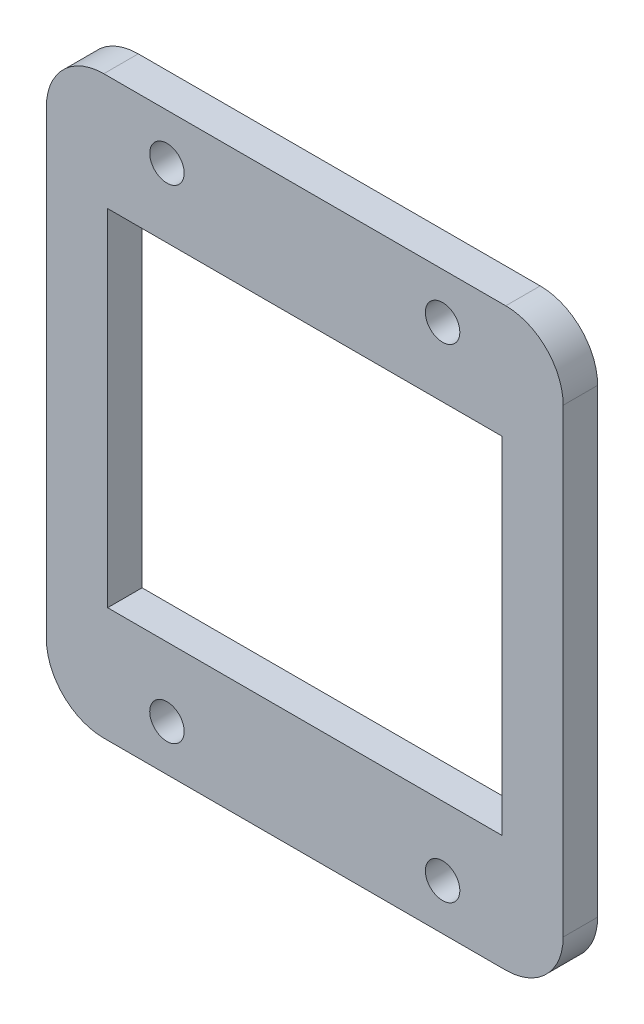
ISO-10303-21;
HEADER;
FILE_DESCRIPTION(('STEP AP214'),'2;1');
FILE_NAME('part.step','',(''),(''),'','','');
FILE_SCHEMA(('AUTOMOTIVE_DESIGN { 1 0 10303 214 1 1 1 1 }'));
ENDSEC;
DATA;
#1=APPLICATION_CONTEXT('core data for automotive mechanical design processes');
#2=APPLICATION_PROTOCOL_DEFINITION('international standard','automotive_design',2000,#1);
#3=PRODUCT_CONTEXT('',#1,'mechanical');
#4=PRODUCT('Part','Part','',(#3));
#5=PRODUCT_RELATED_PRODUCT_CATEGORY('part','',(#4));
#6=PRODUCT_DEFINITION_FORMATION('','',#4);
#7=PRODUCT_DEFINITION_CONTEXT('part definition',#1,'design');
#8=PRODUCT_DEFINITION('design','',#6,#7);
#9=PRODUCT_DEFINITION_SHAPE('','',#8);
#10=(LENGTH_UNIT() NAMED_UNIT(*) SI_UNIT(.MILLI.,.METRE.));
#11=(NAMED_UNIT(*) PLANE_ANGLE_UNIT() SI_UNIT($,.RADIAN.));
#12=(NAMED_UNIT(*) SI_UNIT($,.STERADIAN.) SOLID_ANGLE_UNIT());
#13=UNCERTAINTY_MEASURE_WITH_UNIT(LENGTH_MEASURE(1.E-05),#10,'distance_accuracy_value','');
#14=(GEOMETRIC_REPRESENTATION_CONTEXT(3) GLOBAL_UNCERTAINTY_ASSIGNED_CONTEXT((#13)) GLOBAL_UNIT_ASSIGNED_CONTEXT((#10,
#11,#12)) REPRESENTATION_CONTEXT('',''));
#15=CARTESIAN_POINT('',(0.,0.,0.));
#16=DIRECTION('',(0.,0.,1.));
#17=DIRECTION('',(1.,0.,0.));
#18=AXIS2_PLACEMENT_3D('',#15,#16,#17);
#19=CARTESIAN_POINT('',(0.,0.,3.));
#20=DIRECTION('',(0.,0.,-1.));
#21=DIRECTION('',(-1.,0.,0.));
#22=AXIS2_PLACEMENT_3D('',#19,#20,#21);
#23=PLANE('',#22);
#24=DIRECTION('',(-1.,0.,0.));
#25=VECTOR('',#24,1.);
#26=CARTESIAN_POINT('',(0.,50.1,3.));
#27=LINE('',#26,#25);
#28=CARTESIAN_POINT('',(40.,50.1,3.));
#29=VERTEX_POINT('',#28);
#30=CARTESIAN_POINT('',(5.,50.1,3.));
#31=VERTEX_POINT('',#30);
#32=EDGE_CURVE('E203',#29,#31,#27,.T.);
#33=ORIENTED_EDGE('',*,*,#32,.T.);
#34=CARTESIAN_POINT('',(5.,45.1,3.));
#35=DIRECTION('',(0.,0.,-1.));
#36=DIRECTION('',(-1.,0.,0.));
#37=AXIS2_PLACEMENT_3D('',#34,#35,#36);
#38=CIRCLE('',#37,5.);
#39=CARTESIAN_POINT('',(0.,45.1,3.));
#40=VERTEX_POINT('',#39);
#41=EDGE_CURVE('E254',#31,#40,#38,.F.);
#42=ORIENTED_EDGE('',*,*,#41,.T.);
#43=DIRECTION('',(0.,-1.,0.));
#44=VECTOR('',#43,1.);
#45=CARTESIAN_POINT('',(0.,0.,3.));
#46=LINE('',#45,#44);
#47=CARTESIAN_POINT('',(0.,5.,3.));
#48=VERTEX_POINT('',#47);
#49=EDGE_CURVE('E192',#40,#48,#46,.T.);
#50=ORIENTED_EDGE('',*,*,#49,.T.);
#51=CARTESIAN_POINT('',(5.,5.,3.));
#52=DIRECTION('',(0.,0.,-1.));
#53=DIRECTION('',(-1.,0.,0.));
#54=AXIS2_PLACEMENT_3D('',#51,#52,#53);
#55=CIRCLE('',#54,5.);
#56=CARTESIAN_POINT('',(5.,0.,3.));
#57=VERTEX_POINT('',#56);
#58=EDGE_CURVE('E251',#48,#57,#55,.F.);
#59=ORIENTED_EDGE('',*,*,#58,.T.);
#60=DIRECTION('',(1.,0.,0.));
#61=VECTOR('',#60,1.);
#62=CARTESIAN_POINT('',(0.,0.,3.));
#63=LINE('',#62,#61);
#64=CARTESIAN_POINT('',(40.,0.,3.));
#65=VERTEX_POINT('',#64);
#66=EDGE_CURVE('E196',#57,#65,#63,.T.);
#67=ORIENTED_EDGE('',*,*,#66,.T.);
#68=CARTESIAN_POINT('',(40.,5.,3.));
#69=DIRECTION('',(0.,0.,-1.));
#70=DIRECTION('',(-1.,0.,0.));
#71=AXIS2_PLACEMENT_3D('',#68,#69,#70);
#72=CIRCLE('',#71,5.);
#73=CARTESIAN_POINT('',(45.,5.,3.));
#74=VERTEX_POINT('',#73);
#75=EDGE_CURVE('E65',#65,#74,#72,.F.);
#76=ORIENTED_EDGE('',*,*,#75,.T.);
#77=DIRECTION('',(0.,1.,0.));
#78=VECTOR('',#77,1.);
#79=CARTESIAN_POINT('',(45.,0.,3.));
#80=LINE('',#79,#78);
#81=CARTESIAN_POINT('',(45.,45.1,3.));
#82=VERTEX_POINT('',#81);
#83=EDGE_CURVE('E200',#74,#82,#80,.T.);
#84=ORIENTED_EDGE('',*,*,#83,.T.);
#85=CARTESIAN_POINT('',(40.,45.1,3.));
#86=DIRECTION('',(0.,0.,-1.));
#87=DIRECTION('',(-1.,0.,0.));
#88=AXIS2_PLACEMENT_3D('',#85,#86,#87);
#89=CIRCLE('',#88,5.);
#90=EDGE_CURVE('E246',#82,#29,#89,.F.);
#91=ORIENTED_EDGE('',*,*,#90,.T.);
#92=EDGE_LOOP('',(#33,#42,#50,#59,#67,#76,#84,#91));
#93=FACE_BOUND('',#92,.T.);
#94=DIRECTION('',(0.,-1.,0.));
#95=VECTOR('',#94,1.);
#96=CARTESIAN_POINT('',(5.33482388273665,40.1,3.));
#97=LINE('',#96,#95);
#98=CARTESIAN_POINT('',(5.33482388273665,40.1,3.));
#99=VERTEX_POINT('',#98);
#100=CARTESIAN_POINT('',(5.33482388273665,10.,3.));
#101=VERTEX_POINT('',#100);
#102=EDGE_CURVE('E135',#99,#101,#97,.T.);
#103=ORIENTED_EDGE('',*,*,#102,.F.);
#104=DIRECTION('',(-1.,0.,0.));
#105=VECTOR('',#104,1.);
#106=CARTESIAN_POINT('',(5.33482388273665,40.1,3.));
#107=LINE('',#106,#105);
#108=CARTESIAN_POINT('',(39.6651761172633,40.1,3.));
#109=VERTEX_POINT('',#108);
#110=EDGE_CURVE('E167',#109,#99,#107,.T.);
#111=ORIENTED_EDGE('',*,*,#110,.F.);
#112=DIRECTION('',(0.,1.,0.));
#113=VECTOR('',#112,1.);
#114=CARTESIAN_POINT('',(39.6651761172633,40.1,3.));
#115=LINE('',#114,#113);
#116=CARTESIAN_POINT('',(39.6651761172633,10.,3.));
#117=VERTEX_POINT('',#116);
#118=EDGE_CURVE('E161',#117,#109,#115,.T.);
#119=ORIENTED_EDGE('',*,*,#118,.F.);
#120=DIRECTION('',(1.,0.,0.));
#121=VECTOR('',#120,1.);
#122=CARTESIAN_POINT('',(5.33482388273665,10.,3.));
#123=LINE('',#122,#121);
#124=EDGE_CURVE('E146',#101,#117,#123,.T.);
#125=ORIENTED_EDGE('',*,*,#124,.F.);
#126=EDGE_LOOP('',(#103,#111,#119,#125));
#127=FACE_BOUND('',#126,.T.);
#128=CARTESIAN_POINT('',(10.5,46.1,3.));
#129=DIRECTION('',(0.,0.,1.));
#130=DIRECTION('',(1.,0.,0.));
#131=AXIS2_PLACEMENT_3D('',#128,#129,#130);
#132=CIRCLE('',#131,1.5);
#133=CARTESIAN_POINT('',(12.,46.1,3.));
#134=VERTEX_POINT('',#133);
#135=EDGE_CURVE('E176',#134,#134,#132,.T.);
#136=ORIENTED_EDGE('',*,*,#135,.F.);
#137=EDGE_LOOP('',(#136));
#138=FACE_BOUND('',#137,.T.);
#139=CARTESIAN_POINT('',(34.5,46.1,3.));
#140=DIRECTION('',(0.,0.,1.));
#141=DIRECTION('',(1.,0.,0.));
#142=AXIS2_PLACEMENT_3D('',#139,#140,#141);
#143=CIRCLE('',#142,1.5);
#144=CARTESIAN_POINT('',(36.,46.1,3.));
#145=VERTEX_POINT('',#144);
#146=EDGE_CURVE('E272',#145,#145,#143,.T.);
#147=ORIENTED_EDGE('',*,*,#146,.F.);
#148=EDGE_LOOP('',(#147));
#149=FACE_BOUND('',#148,.T.);
#150=CARTESIAN_POINT('',(34.5,4.,3.));
#151=DIRECTION('',(0.,0.,1.));
#152=DIRECTION('',(-1.,0.,0.));
#153=AXIS2_PLACEMENT_3D('',#150,#151,#152);
#154=CIRCLE('',#153,1.5);
#155=CARTESIAN_POINT('',(33.,4.,3.));
#156=VERTEX_POINT('',#155);
#157=EDGE_CURVE('E273',#156,#156,#154,.T.);
#158=ORIENTED_EDGE('',*,*,#157,.F.);
#159=EDGE_LOOP('',(#158));
#160=FACE_BOUND('',#159,.T.);
#161=CARTESIAN_POINT('',(10.5,4.,3.));
#162=DIRECTION('',(0.,0.,1.));
#163=DIRECTION('',(-1.,0.,0.));
#164=AXIS2_PLACEMENT_3D('',#161,#162,#163);
#165=CIRCLE('',#164,1.5);
#166=CARTESIAN_POINT('',(8.99999999999999,4.,3.));
#167=VERTEX_POINT('',#166);
#168=EDGE_CURVE('E264',#167,#167,#165,.T.);
#169=ORIENTED_EDGE('',*,*,#168,.F.);
#170=EDGE_LOOP('',(#169));
#171=FACE_BOUND('',#170,.T.);
#172=ADVANCED_FACE('F43',(#93,#127,#138,#149,#160,#171),#23,.F.);
#173=CARTESIAN_POINT('',(0.,0.,0.));
#174=DIRECTION('',(0.,0.,-1.));
#175=DIRECTION('',(-1.,0.,0.));
#176=AXIS2_PLACEMENT_3D('',#173,#174,#175);
#177=PLANE('',#176);
#178=CARTESIAN_POINT('',(34.5,4.,0.));
#179=DIRECTION('',(0.,0.,1.));
#180=DIRECTION('',(-1.,0.,0.));
#181=AXIS2_PLACEMENT_3D('',#178,#179,#180);
#182=CIRCLE('',#181,1.5);
#183=CARTESIAN_POINT('',(33.,4.,0.));
#184=VERTEX_POINT('',#183);
#185=EDGE_CURVE('E267',#184,#184,#182,.T.);
#186=ORIENTED_EDGE('',*,*,#185,.T.);
#187=EDGE_LOOP('',(#186));
#188=FACE_BOUND('',#187,.T.);
#189=CARTESIAN_POINT('',(10.5,46.1,0.));
#190=DIRECTION('',(0.,0.,1.));
#191=DIRECTION('',(1.,0.,0.));
#192=AXIS2_PLACEMENT_3D('',#189,#190,#191);
#193=CIRCLE('',#192,1.5);
#194=CARTESIAN_POINT('',(12.,46.1,0.));
#195=VERTEX_POINT('',#194);
#196=EDGE_CURVE('E276',#195,#195,#193,.T.);
#197=ORIENTED_EDGE('',*,*,#196,.T.);
#198=EDGE_LOOP('',(#197));
#199=FACE_BOUND('',#198,.T.);
#200=DIRECTION('',(0.,-1.,0.));
#201=VECTOR('',#200,1.);
#202=CARTESIAN_POINT('',(0.,0.,0.));
#203=LINE('',#202,#201);
#204=CARTESIAN_POINT('',(0.,45.1,0.));
#205=VERTEX_POINT('',#204);
#206=CARTESIAN_POINT('',(0.,5.,0.));
#207=VERTEX_POINT('',#206);
#208=EDGE_CURVE('E155',#205,#207,#203,.T.);
#209=ORIENTED_EDGE('',*,*,#208,.F.);
#210=CARTESIAN_POINT('',(5.,45.1,0.));
#211=DIRECTION('',(0.,0.,-1.));
#212=DIRECTION('',(-1.,0.,0.));
#213=AXIS2_PLACEMENT_3D('',#210,#211,#212);
#214=CIRCLE('',#213,5.);
#215=CARTESIAN_POINT('',(5.,50.1,0.));
#216=VERTEX_POINT('',#215);
#217=EDGE_CURVE('E236',#205,#216,#214,.T.);
#218=ORIENTED_EDGE('',*,*,#217,.T.);
#219=DIRECTION('',(-1.,0.,0.));
#220=VECTOR('',#219,1.);
#221=CARTESIAN_POINT('',(0.,50.1,0.));
#222=LINE('',#221,#220);
#223=CARTESIAN_POINT('',(40.,50.1,0.));
#224=VERTEX_POINT('',#223);
#225=EDGE_CURVE('E197',#224,#216,#222,.T.);
#226=ORIENTED_EDGE('',*,*,#225,.F.);
#227=CARTESIAN_POINT('',(40.,45.1,0.));
#228=DIRECTION('',(0.,0.,-1.));
#229=DIRECTION('',(-1.,0.,0.));
#230=AXIS2_PLACEMENT_3D('',#227,#228,#229);
#231=CIRCLE('',#230,5.);
#232=CARTESIAN_POINT('',(45.,45.1,0.));
#233=VERTEX_POINT('',#232);
#234=EDGE_CURVE('E227',#224,#233,#231,.T.);
#235=ORIENTED_EDGE('',*,*,#234,.T.);
#236=DIRECTION('',(0.,1.,0.));
#237=VECTOR('',#236,1.);
#238=CARTESIAN_POINT('',(45.,0.,0.));
#239=LINE('',#238,#237);
#240=CARTESIAN_POINT('',(45.,5.,0.));
#241=VERTEX_POINT('',#240);
#242=EDGE_CURVE('E215',#241,#233,#239,.T.);
#243=ORIENTED_EDGE('',*,*,#242,.F.);
#244=CARTESIAN_POINT('',(40.,5.,0.));
#245=DIRECTION('',(0.,0.,-1.));
#246=DIRECTION('',(-1.,0.,0.));
#247=AXIS2_PLACEMENT_3D('',#244,#245,#246);
#248=CIRCLE('',#247,5.);
#249=CARTESIAN_POINT('',(40.,0.,0.));
#250=VERTEX_POINT('',#249);
#251=EDGE_CURVE('E230',#241,#250,#248,.T.);
#252=ORIENTED_EDGE('',*,*,#251,.T.);
#253=DIRECTION('',(1.,0.,0.));
#254=VECTOR('',#253,1.);
#255=CARTESIAN_POINT('',(0.,0.,0.));
#256=LINE('',#255,#254);
#257=CARTESIAN_POINT('',(5.,0.,0.));
#258=VERTEX_POINT('',#257);
#259=EDGE_CURVE('E211',#258,#250,#256,.T.);
#260=ORIENTED_EDGE('',*,*,#259,.F.);
#261=CARTESIAN_POINT('',(5.,5.,0.));
#262=DIRECTION('',(0.,0.,-1.));
#263=DIRECTION('',(-1.,0.,0.));
#264=AXIS2_PLACEMENT_3D('',#261,#262,#263);
#265=CIRCLE('',#264,5.);
#266=EDGE_CURVE('E233',#258,#207,#265,.T.);
#267=ORIENTED_EDGE('',*,*,#266,.T.);
#268=EDGE_LOOP('',(#209,#218,#226,#235,#243,#252,#260,#267));
#269=FACE_BOUND('',#268,.T.);
#270=DIRECTION('',(-1.,0.,0.));
#271=VECTOR('',#270,1.);
#272=CARTESIAN_POINT('',(5.33482388273665,40.1,0.));
#273=LINE('',#272,#271);
#274=CARTESIAN_POINT('',(39.6651761172633,40.1,0.));
#275=VERTEX_POINT('',#274);
#276=CARTESIAN_POINT('',(5.33482388273665,40.1,0.));
#277=VERTEX_POINT('',#276);
#278=EDGE_CURVE('E147',#275,#277,#273,.T.);
#279=ORIENTED_EDGE('',*,*,#278,.T.);
#280=DIRECTION('',(0.,-1.,0.));
#281=VECTOR('',#280,1.);
#282=CARTESIAN_POINT('',(5.33482388273665,40.1,0.));
#283=LINE('',#282,#281);
#284=CARTESIAN_POINT('',(5.33482388273665,10.,0.));
#285=VERTEX_POINT('',#284);
#286=EDGE_CURVE('E173',#277,#285,#283,.T.);
#287=ORIENTED_EDGE('',*,*,#286,.T.);
#288=DIRECTION('',(1.,0.,0.));
#289=VECTOR('',#288,1.);
#290=CARTESIAN_POINT('',(5.33482388273665,10.,0.));
#291=LINE('',#290,#289);
#292=CARTESIAN_POINT('',(39.6651761172633,10.,0.));
#293=VERTEX_POINT('',#292);
#294=EDGE_CURVE('E153',#285,#293,#291,.T.);
#295=ORIENTED_EDGE('',*,*,#294,.T.);
#296=DIRECTION('',(0.,1.,0.));
#297=VECTOR('',#296,1.);
#298=CARTESIAN_POINT('',(39.6651761172633,40.1,0.));
#299=LINE('',#298,#297);
#300=EDGE_CURVE('E179',#293,#275,#299,.T.);
#301=ORIENTED_EDGE('',*,*,#300,.T.);
#302=EDGE_LOOP('',(#279,#287,#295,#301));
#303=FACE_BOUND('',#302,.T.);
#304=CARTESIAN_POINT('',(34.5,46.1,0.));
#305=DIRECTION('',(0.,0.,1.));
#306=DIRECTION('',(1.,0.,0.));
#307=AXIS2_PLACEMENT_3D('',#304,#305,#306);
#308=CIRCLE('',#307,1.5);
#309=CARTESIAN_POINT('',(36.,46.1,0.));
#310=VERTEX_POINT('',#309);
#311=EDGE_CURVE('E270',#310,#310,#308,.T.);
#312=ORIENTED_EDGE('',*,*,#311,.T.);
#313=EDGE_LOOP('',(#312));
#314=FACE_BOUND('',#313,.T.);
#315=CARTESIAN_POINT('',(10.5,4.,0.));
#316=DIRECTION('',(0.,0.,1.));
#317=DIRECTION('',(-1.,0.,0.));
#318=AXIS2_PLACEMENT_3D('',#315,#316,#317);
#319=CIRCLE('',#318,1.5);
#320=CARTESIAN_POINT('',(8.99999999999999,4.,0.));
#321=VERTEX_POINT('',#320);
#322=EDGE_CURVE('E268',#321,#321,#319,.T.);
#323=ORIENTED_EDGE('',*,*,#322,.T.);
#324=EDGE_LOOP('',(#323));
#325=FACE_BOUND('',#324,.T.);
#326=ADVANCED_FACE('F301',(#188,#199,#269,#303,#314,#325),#177,.T.);
#327=CARTESIAN_POINT('',(0.,0.,3.));
#328=DIRECTION('',(1.,0.,0.));
#329=DIRECTION('',(0.,0.,-1.));
#330=AXIS2_PLACEMENT_3D('',#327,#328,#329);
#331=PLANE('',#330);
#332=ORIENTED_EDGE('',*,*,#49,.F.);
#333=DIRECTION('',(0.,0.,-1.));
#334=VECTOR('',#333,1.);
#335=CARTESIAN_POINT('',(0.,45.1,3.));
#336=LINE('',#335,#334);
#337=EDGE_CURVE('E223',#40,#205,#336,.T.);
#338=ORIENTED_EDGE('',*,*,#337,.T.);
#339=ORIENTED_EDGE('',*,*,#208,.T.);
#340=DIRECTION('',(0.,0.,-1.));
#341=VECTOR('',#340,1.);
#342=CARTESIAN_POINT('',(0.,5.,3.));
#343=LINE('',#342,#341);
#344=EDGE_CURVE('E207',#207,#48,#343,.F.);
#345=ORIENTED_EDGE('',*,*,#344,.T.);
#346=EDGE_LOOP('',(#332,#338,#339,#345));
#347=FACE_BOUND('',#346,.T.);
#348=ADVANCED_FACE('F345',(#347),#331,.F.);
#349=CARTESIAN_POINT('',(0.,0.,3.));
#350=DIRECTION('',(0.,1.,0.));
#351=DIRECTION('',(0.,0.,1.));
#352=AXIS2_PLACEMENT_3D('',#349,#350,#351);
#353=PLANE('',#352);
#354=ORIENTED_EDGE('',*,*,#66,.F.);
#355=DIRECTION('',(0.,0.,-1.));
#356=VECTOR('',#355,1.);
#357=CARTESIAN_POINT('',(5.,0.,3.));
#358=LINE('',#357,#356);
#359=EDGE_CURVE('E259',#57,#258,#358,.T.);
#360=ORIENTED_EDGE('',*,*,#359,.T.);
#361=ORIENTED_EDGE('',*,*,#259,.T.);
#362=DIRECTION('',(0.,0.,-1.));
#363=VECTOR('',#362,1.);
#364=CARTESIAN_POINT('',(40.,0.,3.));
#365=LINE('',#364,#363);
#366=EDGE_CURVE('E257',#250,#65,#365,.F.);
#367=ORIENTED_EDGE('',*,*,#366,.T.);
#368=EDGE_LOOP('',(#354,#360,#361,#367));
#369=FACE_BOUND('',#368,.T.);
#370=ADVANCED_FACE('F353',(#369),#353,.F.);
#371=CARTESIAN_POINT('',(45.,0.,3.));
#372=DIRECTION('',(-1.,0.,0.));
#373=DIRECTION('',(0.,-1.,0.));
#374=AXIS2_PLACEMENT_3D('',#371,#372,#373);
#375=PLANE('',#374);
#376=ORIENTED_EDGE('',*,*,#83,.F.);
#377=DIRECTION('',(0.,0.,-1.));
#378=VECTOR('',#377,1.);
#379=CARTESIAN_POINT('',(45.,5.,3.));
#380=LINE('',#379,#378);
#381=EDGE_CURVE('E11',#74,#241,#380,.T.);
#382=ORIENTED_EDGE('',*,*,#381,.T.);
#383=ORIENTED_EDGE('',*,*,#242,.T.);
#384=DIRECTION('',(0.,0.,-1.));
#385=VECTOR('',#384,1.);
#386=CARTESIAN_POINT('',(45.,45.1,3.));
#387=LINE('',#386,#385);
#388=EDGE_CURVE('E52',#233,#82,#387,.F.);
#389=ORIENTED_EDGE('',*,*,#388,.T.);
#390=EDGE_LOOP('',(#376,#382,#383,#389));
#391=FACE_BOUND('',#390,.T.);
#392=ADVANCED_FACE('F349',(#391),#375,.F.);
#393=CARTESIAN_POINT('',(0.,50.1,3.));
#394=DIRECTION('',(0.,-1.,0.));
#395=DIRECTION('',(0.,0.,-1.));
#396=AXIS2_PLACEMENT_3D('',#393,#394,#395);
#397=PLANE('',#396);
#398=ORIENTED_EDGE('',*,*,#225,.T.);
#399=DIRECTION('',(0.,0.,-1.));
#400=VECTOR('',#399,1.);
#401=CARTESIAN_POINT('',(5.,50.1,3.));
#402=LINE('',#401,#400);
#403=EDGE_CURVE('E243',#216,#31,#402,.F.);
#404=ORIENTED_EDGE('',*,*,#403,.T.);
#405=ORIENTED_EDGE('',*,*,#32,.F.);
#406=DIRECTION('',(0.,0.,-1.));
#407=VECTOR('',#406,1.);
#408=CARTESIAN_POINT('',(40.,50.1,3.));
#409=LINE('',#408,#407);
#410=EDGE_CURVE('E239',#29,#224,#409,.T.);
#411=ORIENTED_EDGE('',*,*,#410,.T.);
#412=EDGE_LOOP('',(#398,#404,#405,#411));
#413=FACE_BOUND('',#412,.T.);
#414=ADVANCED_FACE('F341',(#413),#397,.F.);
#415=CARTESIAN_POINT('',(5.33482388273665,40.1,3.));
#416=DIRECTION('',(1.,0.,0.));
#417=DIRECTION('',(0.,0.,-1.));
#418=AXIS2_PLACEMENT_3D('',#415,#416,#417);
#419=PLANE('',#418);
#420=ORIENTED_EDGE('',*,*,#286,.F.);
#421=DIRECTION('',(0.,0.,-1.));
#422=VECTOR('',#421,1.);
#423=CARTESIAN_POINT('',(5.33482388273665,40.1,3.));
#424=LINE('',#423,#422);
#425=EDGE_CURVE('E141',#99,#277,#424,.T.);
#426=ORIENTED_EDGE('',*,*,#425,.F.);
#427=ORIENTED_EDGE('',*,*,#102,.T.);
#428=DIRECTION('',(0.,0.,-1.));
#429=VECTOR('',#428,1.);
#430=CARTESIAN_POINT('',(5.33482388273665,10.,3.));
#431=LINE('',#430,#429);
#432=EDGE_CURVE('E138',#101,#285,#431,.T.);
#433=ORIENTED_EDGE('',*,*,#432,.T.);
#434=EDGE_LOOP('',(#420,#426,#427,#433));
#435=FACE_BOUND('',#434,.T.);
#436=ADVANCED_FACE('F137',(#435),#419,.T.);
#437=CARTESIAN_POINT('',(5.33482388273665,10.,3.));
#438=DIRECTION('',(0.,1.,0.));
#439=DIRECTION('',(0.,0.,1.));
#440=AXIS2_PLACEMENT_3D('',#437,#438,#439);
#441=PLANE('',#440);
#442=ORIENTED_EDGE('',*,*,#294,.F.);
#443=ORIENTED_EDGE('',*,*,#432,.F.);
#444=ORIENTED_EDGE('',*,*,#124,.T.);
#445=DIRECTION('',(0.,0.,-1.));
#446=VECTOR('',#445,1.);
#447=CARTESIAN_POINT('',(39.6651761172633,10.,3.));
#448=LINE('',#447,#446);
#449=EDGE_CURVE('E156',#117,#293,#448,.T.);
#450=ORIENTED_EDGE('',*,*,#449,.T.);
#451=EDGE_LOOP('',(#442,#443,#444,#450));
#452=FACE_BOUND('',#451,.T.);
#453=ADVANCED_FACE('F150',(#452),#441,.T.);
#454=CARTESIAN_POINT('',(39.6651761172633,40.1,3.));
#455=DIRECTION('',(-1.,0.,0.));
#456=DIRECTION('',(0.,0.,1.));
#457=AXIS2_PLACEMENT_3D('',#454,#455,#456);
#458=PLANE('',#457);
#459=ORIENTED_EDGE('',*,*,#300,.F.);
#460=ORIENTED_EDGE('',*,*,#449,.F.);
#461=ORIENTED_EDGE('',*,*,#118,.T.);
#462=DIRECTION('',(0.,0.,-1.));
#463=VECTOR('',#462,1.);
#464=CARTESIAN_POINT('',(39.6651761172633,40.1,3.));
#465=LINE('',#464,#463);
#466=EDGE_CURVE('E187',#109,#275,#465,.T.);
#467=ORIENTED_EDGE('',*,*,#466,.T.);
#468=EDGE_LOOP('',(#459,#460,#461,#467));
#469=FACE_BOUND('',#468,.T.);
#470=ADVANCED_FACE('F333',(#469),#458,.T.);
#471=CARTESIAN_POINT('',(5.33482388273665,40.1,3.));
#472=DIRECTION('',(0.,-1.,0.));
#473=DIRECTION('',(0.,0.,-1.));
#474=AXIS2_PLACEMENT_3D('',#471,#472,#473);
#475=PLANE('',#474);
#476=ORIENTED_EDGE('',*,*,#278,.F.);
#477=ORIENTED_EDGE('',*,*,#466,.F.);
#478=ORIENTED_EDGE('',*,*,#110,.T.);
#479=ORIENTED_EDGE('',*,*,#425,.T.);
#480=EDGE_LOOP('',(#476,#477,#478,#479));
#481=FACE_BOUND('',#480,.T.);
#482=ADVANCED_FACE('F330',(#481),#475,.T.);
#483=CARTESIAN_POINT('',(10.5,46.1,3.));
#484=DIRECTION('',(0.,0.,-1.));
#485=DIRECTION('',(-1.,0.,0.));
#486=AXIS2_PLACEMENT_3D('',#483,#484,#485);
#487=CYLINDRICAL_SURFACE('',#486,1.5);
#488=ORIENTED_EDGE('',*,*,#135,.T.);
#489=EDGE_LOOP('',(#488));
#490=FACE_BOUND('',#489,.T.);
#491=ORIENTED_EDGE('',*,*,#196,.F.);
#492=EDGE_LOOP('',(#491));
#493=FACE_BOUND('',#492,.T.);
#494=ADVANCED_FACE('F297',(#490,#493),#487,.F.);
#495=CARTESIAN_POINT('',(34.5,46.1,3.));
#496=DIRECTION('',(0.,0.,-1.));
#497=DIRECTION('',(-1.,0.,0.));
#498=AXIS2_PLACEMENT_3D('',#495,#496,#497);
#499=CYLINDRICAL_SURFACE('',#498,1.5);
#500=ORIENTED_EDGE('',*,*,#146,.T.);
#501=EDGE_LOOP('',(#500));
#502=FACE_BOUND('',#501,.T.);
#503=ORIENTED_EDGE('',*,*,#311,.F.);
#504=EDGE_LOOP('',(#503));
#505=FACE_BOUND('',#504,.T.);
#506=ADVANCED_FACE('F321',(#502,#505),#499,.F.);
#507=CARTESIAN_POINT('',(34.5,4.,3.));
#508=DIRECTION('',(0.,0.,-1.));
#509=DIRECTION('',(-1.,0.,0.));
#510=AXIS2_PLACEMENT_3D('',#507,#508,#509);
#511=CYLINDRICAL_SURFACE('',#510,1.5);
#512=ORIENTED_EDGE('',*,*,#157,.T.);
#513=EDGE_LOOP('',(#512));
#514=FACE_BOUND('',#513,.T.);
#515=ORIENTED_EDGE('',*,*,#185,.F.);
#516=EDGE_LOOP('',(#515));
#517=FACE_BOUND('',#516,.T.);
#518=ADVANCED_FACE('F313',(#514,#517),#511,.F.);
#519=CARTESIAN_POINT('',(10.5,4.,3.));
#520=DIRECTION('',(0.,0.,-1.));
#521=DIRECTION('',(-1.,0.,0.));
#522=AXIS2_PLACEMENT_3D('',#519,#520,#521);
#523=CYLINDRICAL_SURFACE('',#522,1.5);
#524=ORIENTED_EDGE('',*,*,#168,.T.);
#525=EDGE_LOOP('',(#524));
#526=FACE_BOUND('',#525,.T.);
#527=ORIENTED_EDGE('',*,*,#322,.F.);
#528=EDGE_LOOP('',(#527));
#529=FACE_BOUND('',#528,.T.);
#530=ADVANCED_FACE('F309',(#526,#529),#523,.F.);
#531=CARTESIAN_POINT('',(5.,45.1,3.));
#532=DIRECTION('',(0.,0.,-1.));
#533=DIRECTION('',(-1.,0.,0.));
#534=AXIS2_PLACEMENT_3D('',#531,#532,#533);
#535=CYLINDRICAL_SURFACE('',#534,5.);
#536=ORIENTED_EDGE('',*,*,#41,.F.);
#537=ORIENTED_EDGE('',*,*,#403,.F.);
#538=ORIENTED_EDGE('',*,*,#217,.F.);
#539=ORIENTED_EDGE('',*,*,#337,.F.);
#540=EDGE_LOOP('',(#536,#537,#538,#539));
#541=FACE_BOUND('',#540,.T.);
#542=ADVANCED_FACE('F312',(#541),#535,.T.);
#543=CARTESIAN_POINT('',(5.,5.,3.));
#544=DIRECTION('',(0.,0.,-1.));
#545=DIRECTION('',(-1.,0.,0.));
#546=AXIS2_PLACEMENT_3D('',#543,#544,#545);
#547=CYLINDRICAL_SURFACE('',#546,5.);
#548=ORIENTED_EDGE('',*,*,#58,.F.);
#549=ORIENTED_EDGE('',*,*,#344,.F.);
#550=ORIENTED_EDGE('',*,*,#266,.F.);
#551=ORIENTED_EDGE('',*,*,#359,.F.);
#552=EDGE_LOOP('',(#548,#549,#550,#551));
#553=FACE_BOUND('',#552,.T.);
#554=ADVANCED_FACE('F318',(#553),#547,.T.);
#555=CARTESIAN_POINT('',(40.,5.,3.));
#556=DIRECTION('',(0.,0.,-1.));
#557=DIRECTION('',(-1.,0.,0.));
#558=AXIS2_PLACEMENT_3D('',#555,#556,#557);
#559=CYLINDRICAL_SURFACE('',#558,5.);
#560=ORIENTED_EDGE('',*,*,#75,.F.);
#561=ORIENTED_EDGE('',*,*,#366,.F.);
#562=ORIENTED_EDGE('',*,*,#251,.F.);
#563=ORIENTED_EDGE('',*,*,#381,.F.);
#564=EDGE_LOOP('',(#560,#561,#562,#563));
#565=FACE_BOUND('',#564,.T.);
#566=ADVANCED_FACE('F361',(#565),#559,.T.);
#567=CARTESIAN_POINT('',(40.,45.1,3.));
#568=DIRECTION('',(0.,0.,-1.));
#569=DIRECTION('',(-1.,0.,0.));
#570=AXIS2_PLACEMENT_3D('',#567,#568,#569);
#571=CYLINDRICAL_SURFACE('',#570,5.);
#572=ORIENTED_EDGE('',*,*,#90,.F.);
#573=ORIENTED_EDGE('',*,*,#388,.F.);
#574=ORIENTED_EDGE('',*,*,#234,.F.);
#575=ORIENTED_EDGE('',*,*,#410,.F.);
#576=EDGE_LOOP('',(#572,#573,#574,#575));
#577=FACE_BOUND('',#576,.T.);
#578=ADVANCED_FACE('F45',(#577),#571,.T.);
#579=CLOSED_SHELL('',(#172,#326,#348,#370,#392,#414,#436,#453,#470,#482,#494,#506,#518,#530,
#542,#554,#566,#578));
#580=MANIFOLD_SOLID_BREP('B2',#579);
#581=ADVANCED_BREP_SHAPE_REPRESENTATION('',(#18,#580),#14);
#582=SHAPE_DEFINITION_REPRESENTATION(#9,#581);
ENDSEC;
END-ISO-10303-21;
